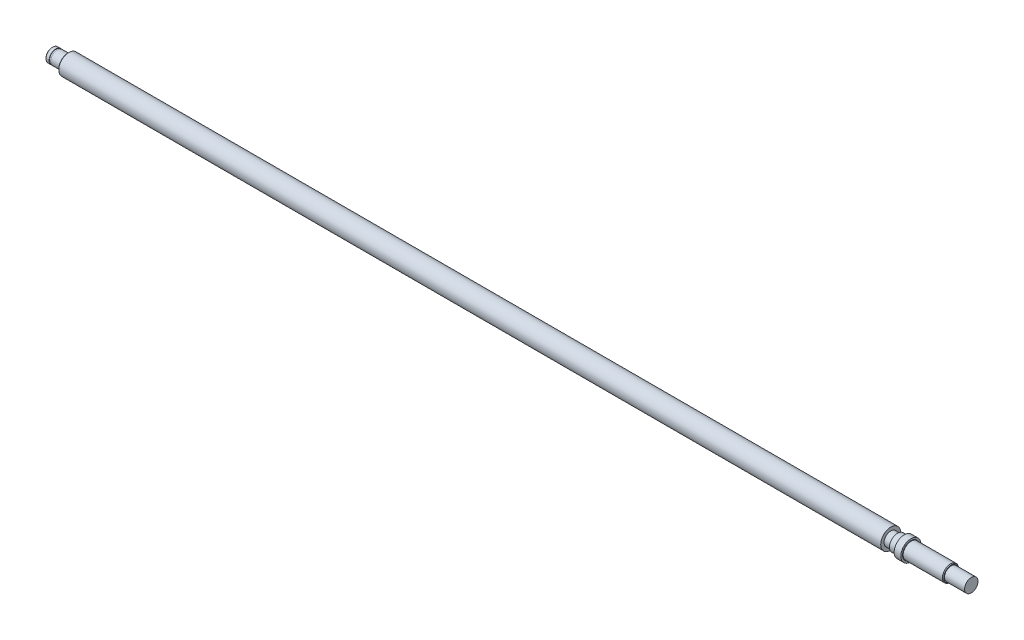
ISO-10303-21;
HEADER;
FILE_DESCRIPTION(('STEP AP214'),'2;1');
FILE_NAME('part.step','',(''),(''),'','','');
FILE_SCHEMA(('AUTOMOTIVE_DESIGN { 1 0 10303 214 1 1 1 1 }'));
ENDSEC;
DATA;
#1=APPLICATION_CONTEXT('core data for automotive mechanical design processes');
#2=APPLICATION_PROTOCOL_DEFINITION('international standard','automotive_design',2000,#1);
#3=PRODUCT_CONTEXT('',#1,'mechanical');
#4=PRODUCT('Part','Part','',(#3));
#5=PRODUCT_RELATED_PRODUCT_CATEGORY('part','',(#4));
#6=PRODUCT_DEFINITION_FORMATION('','',#4);
#7=PRODUCT_DEFINITION_CONTEXT('part definition',#1,'design');
#8=PRODUCT_DEFINITION('design','',#6,#7);
#9=PRODUCT_DEFINITION_SHAPE('','',#8);
#10=(LENGTH_UNIT() NAMED_UNIT(*) SI_UNIT(.MILLI.,.METRE.));
#11=(NAMED_UNIT(*) PLANE_ANGLE_UNIT() SI_UNIT($,.RADIAN.));
#12=(NAMED_UNIT(*) SI_UNIT($,.STERADIAN.) SOLID_ANGLE_UNIT());
#13=UNCERTAINTY_MEASURE_WITH_UNIT(LENGTH_MEASURE(1.E-05),#10,'distance_accuracy_value','');
#14=(GEOMETRIC_REPRESENTATION_CONTEXT(3) GLOBAL_UNCERTAINTY_ASSIGNED_CONTEXT((#13)) GLOBAL_UNIT_ASSIGNED_CONTEXT((#10,
#11,#12)) REPRESENTATION_CONTEXT('',''));
#15=CARTESIAN_POINT('',(0.,0.,0.));
#16=DIRECTION('',(0.,0.,1.));
#17=DIRECTION('',(1.,0.,0.));
#18=AXIS2_PLACEMENT_3D('',#15,#16,#17);
#19=CARTESIAN_POINT('',(0.,0.,0.));
#20=DIRECTION('',(1.,0.,0.));
#21=DIRECTION('',(0.,0.,-1.));
#22=AXIS2_PLACEMENT_3D('',#19,#20,#21);
#23=PLANE('',#22);
#24=CARTESIAN_POINT('',(0.,0.,0.));
#25=DIRECTION('',(1.,0.,0.));
#26=DIRECTION('',(0.,0.,-1.));
#27=AXIS2_PLACEMENT_3D('',#24,#25,#26);
#28=CIRCLE('',#27,7.00000000000001);
#29=CARTESIAN_POINT('',(0.,0.,-7.00000000000001));
#30=VERTEX_POINT('',#29);
#31=EDGE_CURVE('E54',#30,#30,#28,.F.);
#32=ORIENTED_EDGE('',*,*,#31,.T.);
#33=EDGE_LOOP('',(#32));
#34=FACE_BOUND('',#33,.T.);
#35=CARTESIAN_POINT('',(0.,0.,0.));
#36=DIRECTION('',(1.,0.,0.));
#37=DIRECTION('',(0.,0.,-1.));
#38=AXIS2_PLACEMENT_3D('',#35,#36,#37);
#39=CIRCLE('',#38,5.3);
#40=CARTESIAN_POINT('',(0.,0.,-5.3));
#41=VERTEX_POINT('',#40);
#42=EDGE_CURVE('E74',#41,#41,#39,.T.);
#43=ORIENTED_EDGE('',*,*,#42,.T.);
#44=EDGE_LOOP('',(#43));
#45=FACE_BOUND('',#44,.T.);
#46=ADVANCED_FACE('F45',(#34,#45),#23,.F.);
#47=CARTESIAN_POINT('',(0.,0.,0.));
#48=DIRECTION('',(-1.,0.,0.));
#49=DIRECTION('',(0.,0.,1.));
#50=AXIS2_PLACEMENT_3D('',#47,#48,#49);
#51=CYLINDRICAL_SURFACE('',#50,7.5);
#52=CARTESIAN_POINT('',(0.499999999999964,0.,0.));
#53=DIRECTION('',(1.,0.,0.));
#54=DIRECTION('',(0.,0.,-1.));
#55=AXIS2_PLACEMENT_3D('',#52,#53,#54);
#56=CIRCLE('',#55,7.5);
#57=CARTESIAN_POINT('',(0.499999999999964,0.,-7.5));
#58=VERTEX_POINT('',#57);
#59=EDGE_CURVE('E10',#58,#58,#56,.T.);
#60=ORIENTED_EDGE('',*,*,#59,.T.);
#61=EDGE_LOOP('',(#60));
#62=FACE_BOUND('',#61,.T.);
#63=CARTESIAN_POINT('',(613.,0.,0.));
#64=DIRECTION('',(-1.,0.,0.));
#65=DIRECTION('',(0.,0.,1.));
#66=AXIS2_PLACEMENT_3D('',#63,#64,#65);
#67=CIRCLE('',#66,7.5);
#68=CARTESIAN_POINT('',(613.,0.,7.5));
#69=VERTEX_POINT('',#68);
#70=EDGE_CURVE('E78',#69,#69,#67,.T.);
#71=ORIENTED_EDGE('',*,*,#70,.T.);
#72=EDGE_LOOP('',(#71));
#73=FACE_BOUND('',#72,.T.);
#74=ADVANCED_FACE('F166',(#62,#73),#51,.T.);
#75=CARTESIAN_POINT('',(613.,0.,0.));
#76=DIRECTION('',(-1.,0.,0.));
#77=DIRECTION('',(0.,0.,1.));
#78=AXIS2_PLACEMENT_3D('',#75,#76,#77);
#79=PLANE('',#78);
#80=CARTESIAN_POINT('',(613.,0.,0.));
#81=DIRECTION('',(-1.,0.,0.));
#82=DIRECTION('',(0.,0.,1.));
#83=AXIS2_PLACEMENT_3D('',#80,#81,#82);
#84=CIRCLE('',#83,5.);
#85=CARTESIAN_POINT('',(613.,0.,5.));
#86=VERTEX_POINT('',#85);
#87=EDGE_CURVE('E82',#86,#86,#84,.T.);
#88=ORIENTED_EDGE('',*,*,#87,.T.);
#89=EDGE_LOOP('',(#88));
#90=FACE_BOUND('',#89,.T.);
#91=ORIENTED_EDGE('',*,*,#70,.F.);
#92=EDGE_LOOP('',(#91));
#93=FACE_BOUND('',#92,.T.);
#94=ADVANCED_FACE('F171',(#90,#93),#79,.F.);
#95=CARTESIAN_POINT('',(613.,0.,0.));
#96=DIRECTION('',(-1.,0.,0.));
#97=DIRECTION('',(0.,0.,1.));
#98=AXIS2_PLACEMENT_3D('',#95,#96,#97);
#99=CYLINDRICAL_SURFACE('',#98,5.);
#100=ORIENTED_EDGE('',*,*,#87,.F.);
#101=EDGE_LOOP('',(#100));
#102=FACE_BOUND('',#101,.T.);
#103=CARTESIAN_POINT('',(618.,0.,0.));
#104=DIRECTION('',(-1.,0.,0.));
#105=DIRECTION('',(0.,0.,1.));
#106=AXIS2_PLACEMENT_3D('',#103,#104,#105);
#107=CIRCLE('',#106,5.);
#108=CARTESIAN_POINT('',(618.,0.,5.));
#109=VERTEX_POINT('',#108);
#110=EDGE_CURVE('E86',#109,#109,#107,.T.);
#111=ORIENTED_EDGE('',*,*,#110,.T.);
#112=EDGE_LOOP('',(#111));
#113=FACE_BOUND('',#112,.T.);
#114=ADVANCED_FACE('F359',(#102,#113),#99,.T.);
#115=CARTESIAN_POINT('',(618.,5.,0.));
#116=DIRECTION('',(1.,0.,0.));
#117=DIRECTION('',(0.,0.,-1.));
#118=AXIS2_PLACEMENT_3D('',#115,#116,#117);
#119=PLANE('',#118);
#120=ORIENTED_EDGE('',*,*,#110,.F.);
#121=EDGE_LOOP('',(#120));
#122=FACE_BOUND('',#121,.T.);
#123=CARTESIAN_POINT('',(618.,0.,0.));
#124=DIRECTION('',(-1.,0.,0.));
#125=DIRECTION('',(0.,0.,1.));
#126=AXIS2_PLACEMENT_3D('',#123,#124,#125);
#127=CIRCLE('',#126,6.);
#128=CARTESIAN_POINT('',(618.,0.,6.));
#129=VERTEX_POINT('',#128);
#130=EDGE_CURVE('E90',#129,#129,#127,.T.);
#131=ORIENTED_EDGE('',*,*,#130,.T.);
#132=EDGE_LOOP('',(#131));
#133=FACE_BOUND('',#132,.T.);
#134=ADVANCED_FACE('F349',(#122,#133),#119,.F.);
#135=CARTESIAN_POINT('',(613.,0.,0.));
#136=DIRECTION('',(-1.,0.,0.));
#137=DIRECTION('',(0.,0.,1.));
#138=AXIS2_PLACEMENT_3D('',#135,#136,#137);
#139=CYLINDRICAL_SURFACE('',#138,6.);
#140=ORIENTED_EDGE('',*,*,#130,.F.);
#141=EDGE_LOOP('',(#140));
#142=FACE_BOUND('',#141,.T.);
#143=CARTESIAN_POINT('',(623.,0.,0.));
#144=DIRECTION('',(-1.,0.,0.));
#145=DIRECTION('',(0.,0.,1.));
#146=AXIS2_PLACEMENT_3D('',#143,#144,#145);
#147=CIRCLE('',#146,6.);
#148=CARTESIAN_POINT('',(623.,0.,6.));
#149=VERTEX_POINT('',#148);
#150=EDGE_CURVE('E94',#149,#149,#147,.T.);
#151=ORIENTED_EDGE('',*,*,#150,.T.);
#152=EDGE_LOOP('',(#151));
#153=FACE_BOUND('',#152,.T.);
#154=ADVANCED_FACE('F339',(#142,#153),#139,.T.);
#155=CARTESIAN_POINT('',(623.,6.,0.));
#156=DIRECTION('',(1.,0.,0.));
#157=DIRECTION('',(0.,0.,-1.));
#158=AXIS2_PLACEMENT_3D('',#155,#156,#157);
#159=PLANE('',#158);
#160=ORIENTED_EDGE('',*,*,#150,.F.);
#161=EDGE_LOOP('',(#160));
#162=FACE_BOUND('',#161,.T.);
#163=CARTESIAN_POINT('',(623.,0.,0.));
#164=DIRECTION('',(-1.,0.,0.));
#165=DIRECTION('',(0.,0.,1.));
#166=AXIS2_PLACEMENT_3D('',#163,#164,#165);
#167=CIRCLE('',#166,7.5);
#168=CARTESIAN_POINT('',(623.,0.,7.5));
#169=VERTEX_POINT('',#168);
#170=EDGE_CURVE('E98',#169,#169,#167,.T.);
#171=ORIENTED_EDGE('',*,*,#170,.T.);
#172=EDGE_LOOP('',(#171));
#173=FACE_BOUND('',#172,.T.);
#174=ADVANCED_FACE('F329',(#162,#173),#159,.F.);
#175=CARTESIAN_POINT('',(613.,0.,0.));
#176=DIRECTION('',(-1.,0.,0.));
#177=DIRECTION('',(0.,0.,1.));
#178=AXIS2_PLACEMENT_3D('',#175,#176,#177);
#179=CYLINDRICAL_SURFACE('',#178,7.5);
#180=ORIENTED_EDGE('',*,*,#170,.F.);
#181=EDGE_LOOP('',(#180));
#182=FACE_BOUND('',#181,.T.);
#183=CARTESIAN_POINT('',(628.,0.,0.));
#184=DIRECTION('',(-1.,0.,0.));
#185=DIRECTION('',(0.,0.,1.));
#186=AXIS2_PLACEMENT_3D('',#183,#184,#185);
#187=CIRCLE('',#186,7.5);
#188=CARTESIAN_POINT('',(628.,0.,7.5));
#189=VERTEX_POINT('',#188);
#190=EDGE_CURVE('E102',#189,#189,#187,.T.);
#191=ORIENTED_EDGE('',*,*,#190,.T.);
#192=EDGE_LOOP('',(#191));
#193=FACE_BOUND('',#192,.T.);
#194=ADVANCED_FACE('F319',(#182,#193),#179,.T.);
#195=CARTESIAN_POINT('',(628.,7.5,0.));
#196=DIRECTION('',(-1.,0.,0.));
#197=DIRECTION('',(0.,0.,1.));
#198=AXIS2_PLACEMENT_3D('',#195,#196,#197);
#199=PLANE('',#198);
#200=ORIENTED_EDGE('',*,*,#190,.F.);
#201=EDGE_LOOP('',(#200));
#202=FACE_BOUND('',#201,.T.);
#203=CARTESIAN_POINT('',(628.,0.,0.));
#204=DIRECTION('',(-1.,0.,0.));
#205=DIRECTION('',(0.,0.,1.));
#206=AXIS2_PLACEMENT_3D('',#203,#204,#205);
#207=CIRCLE('',#206,6.2);
#208=CARTESIAN_POINT('',(628.,0.,6.2));
#209=VERTEX_POINT('',#208);
#210=EDGE_CURVE('E106',#209,#209,#207,.T.);
#211=ORIENTED_EDGE('',*,*,#210,.T.);
#212=EDGE_LOOP('',(#211));
#213=FACE_BOUND('',#212,.T.);
#214=ADVANCED_FACE('F309',(#202,#213),#199,.F.);
#215=CARTESIAN_POINT('',(628.2,0.,0.));
#216=DIRECTION('',(-1.,0.,0.));
#217=DIRECTION('',(0.,0.,1.));
#218=AXIS2_PLACEMENT_3D('',#215,#216,#217);
#219=CONICAL_SURFACE('',#218,6.,0.785398163397503);
#220=ORIENTED_EDGE('',*,*,#210,.F.);
#221=EDGE_LOOP('',(#220));
#222=FACE_BOUND('',#221,.T.);
#223=CARTESIAN_POINT('',(628.2,0.,0.));
#224=DIRECTION('',(-1.,0.,0.));
#225=DIRECTION('',(0.,0.,1.));
#226=AXIS2_PLACEMENT_3D('',#223,#224,#225);
#227=CIRCLE('',#226,6.);
#228=CARTESIAN_POINT('',(628.2,0.,6.));
#229=VERTEX_POINT('',#228);
#230=EDGE_CURVE('E110',#229,#229,#227,.T.);
#231=ORIENTED_EDGE('',*,*,#230,.T.);
#232=EDGE_LOOP('',(#231));
#233=FACE_BOUND('',#232,.T.);
#234=ADVANCED_FACE('F299',(#222,#233),#219,.T.);
#235=CARTESIAN_POINT('',(613.,0.,0.));
#236=DIRECTION('',(-1.,0.,0.));
#237=DIRECTION('',(0.,0.,1.));
#238=AXIS2_PLACEMENT_3D('',#235,#236,#237);
#239=CYLINDRICAL_SURFACE('',#238,6.);
#240=ORIENTED_EDGE('',*,*,#230,.F.);
#241=EDGE_LOOP('',(#240));
#242=FACE_BOUND('',#241,.T.);
#243=CARTESIAN_POINT('',(657.5,0.,0.));
#244=DIRECTION('',(-1.,0.,0.));
#245=DIRECTION('',(0.,0.,1.));
#246=AXIS2_PLACEMENT_3D('',#243,#244,#245);
#247=CIRCLE('',#246,6.);
#248=CARTESIAN_POINT('',(657.5,0.,6.));
#249=VERTEX_POINT('',#248);
#250=EDGE_CURVE('E114',#249,#249,#247,.T.);
#251=ORIENTED_EDGE('',*,*,#250,.T.);
#252=EDGE_LOOP('',(#251));
#253=FACE_BOUND('',#252,.T.);
#254=ADVANCED_FACE('F289',(#242,#253),#239,.T.);
#255=CARTESIAN_POINT('',(658.,0.,0.));
#256=DIRECTION('',(-1.,0.,0.));
#257=DIRECTION('',(0.,0.,1.));
#258=AXIS2_PLACEMENT_3D('',#255,#256,#257);
#259=CONICAL_SURFACE('',#258,5.5,0.785398163397504);
#260=ORIENTED_EDGE('',*,*,#250,.F.);
#261=EDGE_LOOP('',(#260));
#262=FACE_BOUND('',#261,.T.);
#263=CARTESIAN_POINT('',(658.,0.,0.));
#264=DIRECTION('',(-1.,0.,0.));
#265=DIRECTION('',(0.,0.,1.));
#266=AXIS2_PLACEMENT_3D('',#263,#264,#265);
#267=CIRCLE('',#266,5.5);
#268=CARTESIAN_POINT('',(658.,0.,5.5));
#269=VERTEX_POINT('',#268);
#270=EDGE_CURVE('E118',#269,#269,#267,.T.);
#271=ORIENTED_EDGE('',*,*,#270,.T.);
#272=EDGE_LOOP('',(#271));
#273=FACE_BOUND('',#272,.T.);
#274=ADVANCED_FACE('F279',(#262,#273),#259,.T.);
#275=CARTESIAN_POINT('',(658.,5.5,0.));
#276=DIRECTION('',(-1.,0.,0.));
#277=DIRECTION('',(0.,0.,1.));
#278=AXIS2_PLACEMENT_3D('',#275,#276,#277);
#279=PLANE('',#278);
#280=ORIENTED_EDGE('',*,*,#270,.F.);
#281=EDGE_LOOP('',(#280));
#282=FACE_BOUND('',#281,.T.);
#283=CARTESIAN_POINT('',(658.,0.,0.));
#284=DIRECTION('',(-1.,0.,0.));
#285=DIRECTION('',(0.,0.,1.));
#286=AXIS2_PLACEMENT_3D('',#283,#284,#285);
#287=CIRCLE('',#286,5.);
#288=CARTESIAN_POINT('',(658.,0.,5.));
#289=VERTEX_POINT('',#288);
#290=EDGE_CURVE('E122',#289,#289,#287,.T.);
#291=ORIENTED_EDGE('',*,*,#290,.T.);
#292=EDGE_LOOP('',(#291));
#293=FACE_BOUND('',#292,.T.);
#294=ADVANCED_FACE('F269',(#282,#293),#279,.F.);
#295=CARTESIAN_POINT('',(613.,0.,0.));
#296=DIRECTION('',(-1.,0.,0.));
#297=DIRECTION('',(0.,0.,1.));
#298=AXIS2_PLACEMENT_3D('',#295,#296,#297);
#299=CYLINDRICAL_SURFACE('',#298,5.);
#300=ORIENTED_EDGE('',*,*,#290,.F.);
#301=EDGE_LOOP('',(#300));
#302=FACE_BOUND('',#301,.T.);
#303=CARTESIAN_POINT('',(673.,0.,0.));
#304=DIRECTION('',(-1.,0.,0.));
#305=DIRECTION('',(0.,0.,1.));
#306=AXIS2_PLACEMENT_3D('',#303,#304,#305);
#307=CIRCLE('',#306,5.);
#308=CARTESIAN_POINT('',(673.,0.,5.));
#309=VERTEX_POINT('',#308);
#310=EDGE_CURVE('E126',#309,#309,#307,.T.);
#311=ORIENTED_EDGE('',*,*,#310,.T.);
#312=EDGE_LOOP('',(#311));
#313=FACE_BOUND('',#312,.T.);
#314=ADVANCED_FACE('F259',(#302,#313),#299,.T.);
#315=CARTESIAN_POINT('',(673.,5.,0.));
#316=DIRECTION('',(-1.,0.,0.));
#317=DIRECTION('',(0.,0.,1.));
#318=AXIS2_PLACEMENT_3D('',#315,#316,#317);
#319=PLANE('',#318);
#320=ORIENTED_EDGE('',*,*,#310,.F.);
#321=EDGE_LOOP('',(#320));
#322=FACE_BOUND('',#321,.T.);
#323=ADVANCED_FACE('F250',(#322),#319,.F.);
#324=CARTESIAN_POINT('',(0.,0.,0.));
#325=DIRECTION('',(1.,0.,0.));
#326=DIRECTION('',(0.,0.,-1.));
#327=AXIS2_PLACEMENT_3D('',#324,#325,#326);
#328=CYLINDRICAL_SURFACE('',#327,5.);
#329=CARTESIAN_POINT('',(-0.3,0.,0.));
#330=DIRECTION('',(1.,0.,0.));
#331=DIRECTION('',(0.,0.,-1.));
#332=AXIS2_PLACEMENT_3D('',#329,#330,#331);
#333=CIRCLE('',#332,5.);
#334=CARTESIAN_POINT('',(-0.3,0.,-5.));
#335=VERTEX_POINT('',#334);
#336=EDGE_CURVE('E70',#335,#335,#333,.F.);
#337=ORIENTED_EDGE('',*,*,#336,.T.);
#338=EDGE_LOOP('',(#337));
#339=FACE_BOUND('',#338,.T.);
#340=CARTESIAN_POINT('',(-8.,0.,0.));
#341=DIRECTION('',(1.,0.,0.));
#342=DIRECTION('',(0.,0.,-1.));
#343=AXIS2_PLACEMENT_3D('',#340,#341,#342);
#344=CIRCLE('',#343,5.);
#345=CARTESIAN_POINT('',(-8.,0.,-5.));
#346=VERTEX_POINT('',#345);
#347=EDGE_CURVE('E130',#346,#346,#344,.T.);
#348=ORIENTED_EDGE('',*,*,#347,.T.);
#349=EDGE_LOOP('',(#348));
#350=FACE_BOUND('',#349,.T.);
#351=ADVANCED_FACE('F240',(#339,#350),#328,.T.);
#352=CARTESIAN_POINT('',(-8.,5.,0.));
#353=DIRECTION('',(-1.,0.,0.));
#354=DIRECTION('',(0.,0.,1.));
#355=AXIS2_PLACEMENT_3D('',#352,#353,#354);
#356=PLANE('',#355);
#357=CARTESIAN_POINT('',(-8.,0.,0.));
#358=DIRECTION('',(1.,0.,0.));
#359=DIRECTION('',(0.,0.,-1.));
#360=AXIS2_PLACEMENT_3D('',#357,#358,#359);
#361=CIRCLE('',#360,4.8);
#362=CARTESIAN_POINT('',(-8.,0.,-4.8));
#363=VERTEX_POINT('',#362);
#364=EDGE_CURVE('E134',#363,#363,#361,.T.);
#365=ORIENTED_EDGE('',*,*,#364,.T.);
#366=EDGE_LOOP('',(#365));
#367=FACE_BOUND('',#366,.T.);
#368=ORIENTED_EDGE('',*,*,#347,.F.);
#369=EDGE_LOOP('',(#368));
#370=FACE_BOUND('',#369,.T.);
#371=ADVANCED_FACE('F230',(#367,#370),#356,.T.);
#372=CARTESIAN_POINT('',(0.,0.,0.));
#373=DIRECTION('',(1.,0.,0.));
#374=DIRECTION('',(0.,0.,-1.));
#375=AXIS2_PLACEMENT_3D('',#372,#373,#374);
#376=CYLINDRICAL_SURFACE('',#375,4.8);
#377=CARTESIAN_POINT('',(-9.15,0.,0.));
#378=DIRECTION('',(1.,0.,0.));
#379=DIRECTION('',(0.,0.,-1.));
#380=AXIS2_PLACEMENT_3D('',#377,#378,#379);
#381=CIRCLE('',#380,4.8);
#382=CARTESIAN_POINT('',(-9.15,0.,-4.8));
#383=VERTEX_POINT('',#382);
#384=EDGE_CURVE('E138',#383,#383,#381,.T.);
#385=ORIENTED_EDGE('',*,*,#384,.T.);
#386=EDGE_LOOP('',(#385));
#387=FACE_BOUND('',#386,.T.);
#388=ORIENTED_EDGE('',*,*,#364,.F.);
#389=EDGE_LOOP('',(#388));
#390=FACE_BOUND('',#389,.T.);
#391=ADVANCED_FACE('F163',(#387,#390),#376,.T.);
#392=CARTESIAN_POINT('',(-9.15,4.8,0.));
#393=DIRECTION('',(1.,0.,0.));
#394=DIRECTION('',(0.,0.,-1.));
#395=AXIS2_PLACEMENT_3D('',#392,#393,#394);
#396=PLANE('',#395);
#397=CARTESIAN_POINT('',(-9.15,0.,0.));
#398=DIRECTION('',(1.,0.,0.));
#399=DIRECTION('',(0.,0.,-1.));
#400=AXIS2_PLACEMENT_3D('',#397,#398,#399);
#401=CIRCLE('',#400,5.);
#402=CARTESIAN_POINT('',(-9.15,0.,-5.));
#403=VERTEX_POINT('',#402);
#404=EDGE_CURVE('E142',#403,#403,#401,.T.);
#405=ORIENTED_EDGE('',*,*,#404,.T.);
#406=EDGE_LOOP('',(#405));
#407=FACE_BOUND('',#406,.T.);
#408=ORIENTED_EDGE('',*,*,#384,.F.);
#409=EDGE_LOOP('',(#408));
#410=FACE_BOUND('',#409,.T.);
#411=ADVANCED_FACE('F147',(#407,#410),#396,.T.);
#412=CARTESIAN_POINT('',(0.,0.,0.));
#413=DIRECTION('',(1.,0.,0.));
#414=DIRECTION('',(0.,0.,-1.));
#415=AXIS2_PLACEMENT_3D('',#412,#413,#414);
#416=CYLINDRICAL_SURFACE('',#415,5.);
#417=CARTESIAN_POINT('',(-11.5,0.,0.));
#418=DIRECTION('',(-1.,0.,0.));
#419=DIRECTION('',(0.,0.,1.));
#420=AXIS2_PLACEMENT_3D('',#417,#418,#419);
#421=CIRCLE('',#420,5.);
#422=CARTESIAN_POINT('',(-11.5,0.,5.));
#423=VERTEX_POINT('',#422);
#424=EDGE_CURVE('E64',#423,#423,#421,.F.);
#425=ORIENTED_EDGE('',*,*,#424,.T.);
#426=EDGE_LOOP('',(#425));
#427=FACE_BOUND('',#426,.T.);
#428=ORIENTED_EDGE('',*,*,#404,.F.);
#429=EDGE_LOOP('',(#428));
#430=FACE_BOUND('',#429,.T.);
#431=ADVANCED_FACE('F150',(#427,#430),#416,.T.);
#432=CARTESIAN_POINT('',(-12.,5.,0.));
#433=DIRECTION('',(-1.,0.,0.));
#434=DIRECTION('',(0.,0.,1.));
#435=AXIS2_PLACEMENT_3D('',#432,#433,#434);
#436=PLANE('',#435);
#437=CARTESIAN_POINT('',(-12.,0.,0.));
#438=DIRECTION('',(-1.,0.,0.));
#439=DIRECTION('',(0.,0.,1.));
#440=AXIS2_PLACEMENT_3D('',#437,#438,#439);
#441=CIRCLE('',#440,4.5);
#442=CARTESIAN_POINT('',(-12.,0.,4.5));
#443=VERTEX_POINT('',#442);
#444=EDGE_CURVE('E59',#443,#443,#441,.T.);
#445=ORIENTED_EDGE('',*,*,#444,.T.);
#446=EDGE_LOOP('',(#445));
#447=FACE_BOUND('',#446,.T.);
#448=ADVANCED_FACE('F152',(#447),#436,.T.);
#449=CARTESIAN_POINT('',(-0.3,0.,0.));
#450=DIRECTION('',(1.,0.,0.));
#451=DIRECTION('',(0.,0.,-1.));
#452=AXIS2_PLACEMENT_3D('',#449,#450,#451);
#453=TOROIDAL_SURFACE('',#452,5.3,0.3);
#454=ORIENTED_EDGE('',*,*,#336,.F.);
#455=EDGE_LOOP('',(#454));
#456=FACE_BOUND('',#455,.T.);
#457=ORIENTED_EDGE('',*,*,#42,.F.);
#458=EDGE_LOOP('',(#457));
#459=FACE_BOUND('',#458,.T.);
#460=ADVANCED_FACE('F159',(#456,#459),#453,.F.);
#461=CARTESIAN_POINT('',(-11.5,0.,0.));
#462=DIRECTION('',(1.,0.,0.));
#463=DIRECTION('',(0.,0.,-1.));
#464=AXIS2_PLACEMENT_3D('',#461,#462,#463);
#465=CONICAL_SURFACE('',#464,5.,0.785398163397466);
#466=ORIENTED_EDGE('',*,*,#444,.F.);
#467=EDGE_LOOP('',(#466));
#468=FACE_BOUND('',#467,.T.);
#469=ORIENTED_EDGE('',*,*,#424,.F.);
#470=EDGE_LOOP('',(#469));
#471=FACE_BOUND('',#470,.T.);
#472=ADVANCED_FACE('F176',(#468,#471),#465,.T.);
#473=CARTESIAN_POINT('',(0.,0.,0.));
#474=DIRECTION('',(1.,0.,0.));
#475=DIRECTION('',(0.,0.,-1.));
#476=AXIS2_PLACEMENT_3D('',#473,#474,#475);
#477=CONICAL_SURFACE('',#476,7.00000000000001,0.785398163397479);
#478=ORIENTED_EDGE('',*,*,#59,.F.);
#479=EDGE_LOOP('',(#478));
#480=FACE_BOUND('',#479,.T.);
#481=ORIENTED_EDGE('',*,*,#31,.F.);
#482=EDGE_LOOP('',(#481));
#483=FACE_BOUND('',#482,.T.);
#484=ADVANCED_FACE('F48',(#480,#483),#477,.T.);
#485=CLOSED_SHELL('',(#46,#74,#94,#114,#134,#154,#174,#194,#214,#234,#254,#274,#294,#314,#323,
#351,#371,#391,#411,#431,#448,#460,#472,#484));
#486=MANIFOLD_SOLID_BREP('B2',#485);
#487=ADVANCED_BREP_SHAPE_REPRESENTATION('',(#18,#486),#14);
#488=SHAPE_DEFINITION_REPRESENTATION(#9,#487);
ENDSEC;
END-ISO-10303-21;
